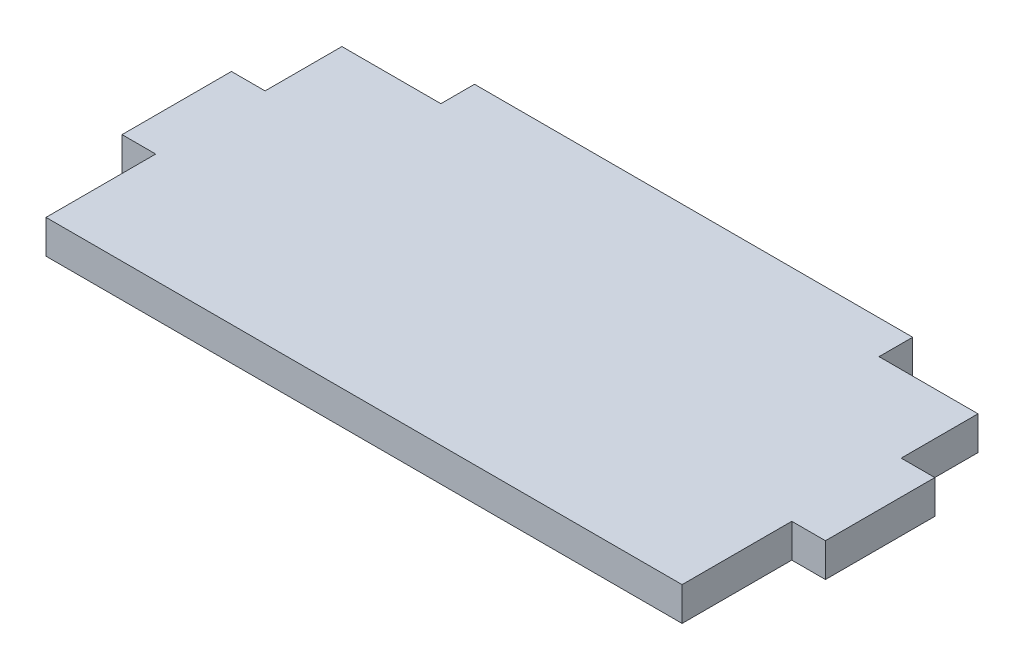
ISO-10303-21;
HEADER;
FILE_DESCRIPTION(('STEP AP214'),'2;1');
FILE_NAME('part.step','',(''),(''),'','','');
FILE_SCHEMA(('AUTOMOTIVE_DESIGN { 1 0 10303 214 1 1 1 1 }'));
ENDSEC;
DATA;
#1=APPLICATION_CONTEXT('core data for automotive mechanical design processes');
#2=APPLICATION_PROTOCOL_DEFINITION('international standard','automotive_design',2000,#1);
#3=PRODUCT_CONTEXT('',#1,'mechanical');
#4=PRODUCT('Part','Part','',(#3));
#5=PRODUCT_RELATED_PRODUCT_CATEGORY('part','',(#4));
#6=PRODUCT_DEFINITION_FORMATION('','',#4);
#7=PRODUCT_DEFINITION_CONTEXT('part definition',#1,'design');
#8=PRODUCT_DEFINITION('design','',#6,#7);
#9=PRODUCT_DEFINITION_SHAPE('','',#8);
#10=(LENGTH_UNIT() NAMED_UNIT(*) SI_UNIT(.MILLI.,.METRE.));
#11=(NAMED_UNIT(*) PLANE_ANGLE_UNIT() SI_UNIT($,.RADIAN.));
#12=(NAMED_UNIT(*) SI_UNIT($,.STERADIAN.) SOLID_ANGLE_UNIT());
#13=UNCERTAINTY_MEASURE_WITH_UNIT(LENGTH_MEASURE(1.E-05),#10,'distance_accuracy_value','');
#14=(GEOMETRIC_REPRESENTATION_CONTEXT(3) GLOBAL_UNCERTAINTY_ASSIGNED_CONTEXT((#13)) GLOBAL_UNIT_ASSIGNED_CONTEXT((#10,
#11,#12)) REPRESENTATION_CONTEXT('',''));
#15=CARTESIAN_POINT('',(0.,0.,0.));
#16=DIRECTION('',(0.,0.,1.));
#17=DIRECTION('',(1.,0.,0.));
#18=AXIS2_PLACEMENT_3D('',#15,#16,#17);
#19=CARTESIAN_POINT('',(-19.99,95.99,-4.07));
#20=DIRECTION('',(0.,0.,1.));
#21=DIRECTION('',(1.,0.,0.));
#22=AXIS2_PLACEMENT_3D('',#19,#20,#21);
#23=PLANE('',#22);
#24=DIRECTION('',(-1.,0.,0.));
#25=VECTOR('',#24,1.);
#26=CARTESIAN_POINT('',(-19.99,92.92,-4.07));
#27=LINE('',#26,#25);
#28=CARTESIAN_POINT('',(19.99,92.92,-4.07));
#29=VERTEX_POINT('',#28);
#30=CARTESIAN_POINT('',(-19.99,92.92,-4.07));
#31=VERTEX_POINT('',#30);
#32=EDGE_CURVE('E187',#29,#31,#27,.T.);
#33=ORIENTED_EDGE('',*,*,#32,.T.);
#34=DIRECTION('',(0.,-1.,0.));
#35=VECTOR('',#34,1.);
#36=CARTESIAN_POINT('',(-19.99,95.99,-4.07));
#37=LINE('',#36,#35);
#38=CARTESIAN_POINT('',(-19.99,95.99,-4.07));
#39=VERTEX_POINT('',#38);
#40=EDGE_CURVE('E11',#39,#31,#37,.T.);
#41=ORIENTED_EDGE('',*,*,#40,.F.);
#42=DIRECTION('',(-1.,0.,0.));
#43=VECTOR('',#42,1.);
#44=CARTESIAN_POINT('',(-19.99,95.99,-4.07));
#45=LINE('',#44,#43);
#46=CARTESIAN_POINT('',(19.99,95.99,-4.07));
#47=VERTEX_POINT('',#46);
#48=EDGE_CURVE('E217',#47,#39,#45,.T.);
#49=ORIENTED_EDGE('',*,*,#48,.F.);
#50=DIRECTION('',(0.,-1.,0.));
#51=VECTOR('',#50,1.);
#52=CARTESIAN_POINT('',(19.99,95.99,-4.07));
#53=LINE('',#52,#51);
#54=EDGE_CURVE('E183',#47,#29,#53,.T.);
#55=ORIENTED_EDGE('',*,*,#54,.T.);
#56=EDGE_LOOP('',(#33,#41,#49,#55));
#57=FACE_BOUND('',#56,.T.);
#58=ADVANCED_FACE('F43',(#57),#23,.F.);
#59=CARTESIAN_POINT('',(-19.99,95.99,-1.));
#60=DIRECTION('',(1.,0.,0.));
#61=DIRECTION('',(0.,0.,-1.));
#62=AXIS2_PLACEMENT_3D('',#59,#60,#61);
#63=PLANE('',#62);
#64=DIRECTION('',(0.,0.,1.));
#65=VECTOR('',#64,1.);
#66=CARTESIAN_POINT('',(-19.99,92.92,-1.));
#67=LINE('',#66,#65);
#68=CARTESIAN_POINT('',(-19.99,92.92,-1.));
#69=VERTEX_POINT('',#68);
#70=EDGE_CURVE('E190',#31,#69,#67,.T.);
#71=ORIENTED_EDGE('',*,*,#70,.T.);
#72=DIRECTION('',(0.,-1.,0.));
#73=VECTOR('',#72,1.);
#74=CARTESIAN_POINT('',(-19.99,95.99,-1.));
#75=LINE('',#74,#73);
#76=CARTESIAN_POINT('',(-19.99,95.99,-1.));
#77=VERTEX_POINT('',#76);
#78=EDGE_CURVE('E51',#77,#69,#75,.T.);
#79=ORIENTED_EDGE('',*,*,#78,.F.);
#80=DIRECTION('',(0.,0.,1.));
#81=VECTOR('',#80,1.);
#82=CARTESIAN_POINT('',(-19.99,95.99,-1.));
#83=LINE('',#82,#81);
#84=EDGE_CURVE('E126',#39,#77,#83,.T.);
#85=ORIENTED_EDGE('',*,*,#84,.F.);
#86=ORIENTED_EDGE('',*,*,#40,.T.);
#87=EDGE_LOOP('',(#71,#79,#85,#86));
#88=FACE_BOUND('',#87,.T.);
#89=ADVANCED_FACE('F316',(#88),#63,.F.);
#90=CARTESIAN_POINT('',(-29.02,95.99,-1.));
#91=DIRECTION('',(0.,0.,1.));
#92=DIRECTION('',(1.,0.,0.));
#93=AXIS2_PLACEMENT_3D('',#90,#91,#92);
#94=PLANE('',#93);
#95=DIRECTION('',(-1.,0.,0.));
#96=VECTOR('',#95,1.);
#97=CARTESIAN_POINT('',(-29.02,92.92,-1.));
#98=LINE('',#97,#96);
#99=CARTESIAN_POINT('',(-29.02,92.92,-1.));
#100=VERTEX_POINT('',#99);
#101=EDGE_CURVE('E192',#69,#100,#98,.T.);
#102=ORIENTED_EDGE('',*,*,#101,.T.);
#103=DIRECTION('',(0.,-1.,0.));
#104=VECTOR('',#103,1.);
#105=CARTESIAN_POINT('',(-29.02,95.99,-1.));
#106=LINE('',#105,#104);
#107=CARTESIAN_POINT('',(-29.02,95.99,-1.));
#108=VERTEX_POINT('',#107);
#109=EDGE_CURVE('E248',#108,#100,#106,.T.);
#110=ORIENTED_EDGE('',*,*,#109,.F.);
#111=DIRECTION('',(-1.,0.,0.));
#112=VECTOR('',#111,1.);
#113=CARTESIAN_POINT('',(-29.02,95.99,-1.));
#114=LINE('',#113,#112);
#115=EDGE_CURVE('E256',#77,#108,#114,.T.);
#116=ORIENTED_EDGE('',*,*,#115,.F.);
#117=ORIENTED_EDGE('',*,*,#78,.T.);
#118=EDGE_LOOP('',(#102,#110,#116,#117));
#119=FACE_BOUND('',#118,.T.);
#120=ADVANCED_FACE('F254',(#119),#94,.F.);
#121=CARTESIAN_POINT('',(-29.02,95.99,6.01));
#122=DIRECTION('',(1.,0.,0.));
#123=DIRECTION('',(0.,0.,-1.));
#124=AXIS2_PLACEMENT_3D('',#121,#122,#123);
#125=PLANE('',#124);
#126=DIRECTION('',(0.,0.,1.));
#127=VECTOR('',#126,1.);
#128=CARTESIAN_POINT('',(-29.02,92.92,6.01));
#129=LINE('',#128,#127);
#130=CARTESIAN_POINT('',(-29.02,92.92,6.01));
#131=VERTEX_POINT('',#130);
#132=EDGE_CURVE('E194',#100,#131,#129,.T.);
#133=ORIENTED_EDGE('',*,*,#132,.T.);
#134=DIRECTION('',(0.,-1.,0.));
#135=VECTOR('',#134,1.);
#136=CARTESIAN_POINT('',(-29.02,95.99,6.01));
#137=LINE('',#136,#135);
#138=CARTESIAN_POINT('',(-29.02,95.99,6.01));
#139=VERTEX_POINT('',#138);
#140=EDGE_CURVE('E245',#139,#131,#137,.T.);
#141=ORIENTED_EDGE('',*,*,#140,.F.);
#142=DIRECTION('',(0.,0.,1.));
#143=VECTOR('',#142,1.);
#144=CARTESIAN_POINT('',(-29.02,95.99,6.01));
#145=LINE('',#144,#143);
#146=EDGE_CURVE('E274',#108,#139,#145,.T.);
#147=ORIENTED_EDGE('',*,*,#146,.F.);
#148=ORIENTED_EDGE('',*,*,#109,.T.);
#149=EDGE_LOOP('',(#133,#141,#147,#148));
#150=FACE_BOUND('',#149,.T.);
#151=ADVANCED_FACE('F265',(#150),#125,.F.);
#152=CARTESIAN_POINT('',(-32.09,95.99,6.01));
#153=DIRECTION('',(0.,0.,1.));
#154=DIRECTION('',(1.,0.,0.));
#155=AXIS2_PLACEMENT_3D('',#152,#153,#154);
#156=PLANE('',#155);
#157=DIRECTION('',(-1.,0.,0.));
#158=VECTOR('',#157,1.);
#159=CARTESIAN_POINT('',(-32.09,92.92,6.01));
#160=LINE('',#159,#158);
#161=CARTESIAN_POINT('',(-32.09,92.92,6.01));
#162=VERTEX_POINT('',#161);
#163=EDGE_CURVE('E196',#131,#162,#160,.T.);
#164=ORIENTED_EDGE('',*,*,#163,.T.);
#165=DIRECTION('',(0.,-1.,0.));
#166=VECTOR('',#165,1.);
#167=CARTESIAN_POINT('',(-32.09,95.99,6.01));
#168=LINE('',#167,#166);
#169=CARTESIAN_POINT('',(-32.09,95.99,6.01));
#170=VERTEX_POINT('',#169);
#171=EDGE_CURVE('E242',#170,#162,#168,.T.);
#172=ORIENTED_EDGE('',*,*,#171,.F.);
#173=DIRECTION('',(-1.,0.,0.));
#174=VECTOR('',#173,1.);
#175=CARTESIAN_POINT('',(-32.09,95.99,6.01));
#176=LINE('',#175,#174);
#177=EDGE_CURVE('E271',#139,#170,#176,.T.);
#178=ORIENTED_EDGE('',*,*,#177,.F.);
#179=ORIENTED_EDGE('',*,*,#140,.T.);
#180=EDGE_LOOP('',(#164,#172,#178,#179));
#181=FACE_BOUND('',#180,.T.);
#182=ADVANCED_FACE('F269',(#181),#156,.F.);
#183=CARTESIAN_POINT('',(-32.09,95.99,15.99));
#184=DIRECTION('',(1.,0.,0.));
#185=DIRECTION('',(0.,0.,-1.));
#186=AXIS2_PLACEMENT_3D('',#183,#184,#185);
#187=PLANE('',#186);
#188=DIRECTION('',(0.,0.,1.));
#189=VECTOR('',#188,1.);
#190=CARTESIAN_POINT('',(-32.09,92.92,15.99));
#191=LINE('',#190,#189);
#192=CARTESIAN_POINT('',(-32.09,92.92,15.99));
#193=VERTEX_POINT('',#192);
#194=EDGE_CURVE('E198',#162,#193,#191,.T.);
#195=ORIENTED_EDGE('',*,*,#194,.T.);
#196=DIRECTION('',(0.,-1.,0.));
#197=VECTOR('',#196,1.);
#198=CARTESIAN_POINT('',(-32.09,95.99,15.99));
#199=LINE('',#198,#197);
#200=CARTESIAN_POINT('',(-32.09,95.99,15.99));
#201=VERTEX_POINT('',#200);
#202=EDGE_CURVE('E239',#201,#193,#199,.T.);
#203=ORIENTED_EDGE('',*,*,#202,.F.);
#204=DIRECTION('',(0.,0.,1.));
#205=VECTOR('',#204,1.);
#206=CARTESIAN_POINT('',(-32.09,95.99,15.99));
#207=LINE('',#206,#205);
#208=EDGE_CURVE('E273',#170,#201,#207,.T.);
#209=ORIENTED_EDGE('',*,*,#208,.F.);
#210=ORIENTED_EDGE('',*,*,#171,.T.);
#211=EDGE_LOOP('',(#195,#203,#209,#210));
#212=FACE_BOUND('',#211,.T.);
#213=ADVANCED_FACE('F331',(#212),#187,.F.);
#214=CARTESIAN_POINT('',(-29.02,95.99,15.99));
#215=DIRECTION('',(0.,0.,-1.));
#216=DIRECTION('',(-1.,0.,0.));
#217=AXIS2_PLACEMENT_3D('',#214,#215,#216);
#218=PLANE('',#217);
#219=DIRECTION('',(1.,0.,0.));
#220=VECTOR('',#219,1.);
#221=CARTESIAN_POINT('',(-29.02,92.92,15.99));
#222=LINE('',#221,#220);
#223=CARTESIAN_POINT('',(-29.02,92.92,15.99));
#224=VERTEX_POINT('',#223);
#225=EDGE_CURVE('E200',#193,#224,#222,.T.);
#226=ORIENTED_EDGE('',*,*,#225,.T.);
#227=DIRECTION('',(0.,-1.,0.));
#228=VECTOR('',#227,1.);
#229=CARTESIAN_POINT('',(-29.02,95.99,15.99));
#230=LINE('',#229,#228);
#231=CARTESIAN_POINT('',(-29.02,95.99,15.99));
#232=VERTEX_POINT('',#231);
#233=EDGE_CURVE('E236',#232,#224,#230,.T.);
#234=ORIENTED_EDGE('',*,*,#233,.F.);
#235=DIRECTION('',(1.,0.,0.));
#236=VECTOR('',#235,1.);
#237=CARTESIAN_POINT('',(-29.02,95.99,15.99));
#238=LINE('',#237,#236);
#239=EDGE_CURVE('E276',#201,#232,#238,.T.);
#240=ORIENTED_EDGE('',*,*,#239,.F.);
#241=ORIENTED_EDGE('',*,*,#202,.T.);
#242=EDGE_LOOP('',(#226,#234,#240,#241));
#243=FACE_BOUND('',#242,.T.);
#244=ADVANCED_FACE('F334',(#243),#218,.F.);
#245=CARTESIAN_POINT('',(-29.02,95.99,26.));
#246=DIRECTION('',(1.,0.,0.));
#247=DIRECTION('',(0.,0.,-1.));
#248=AXIS2_PLACEMENT_3D('',#245,#246,#247);
#249=PLANE('',#248);
#250=DIRECTION('',(0.,0.,1.));
#251=VECTOR('',#250,1.);
#252=CARTESIAN_POINT('',(-29.02,92.92,26.));
#253=LINE('',#252,#251);
#254=CARTESIAN_POINT('',(-29.02,92.92,26.));
#255=VERTEX_POINT('',#254);
#256=EDGE_CURVE('E202',#224,#255,#253,.T.);
#257=ORIENTED_EDGE('',*,*,#256,.T.);
#258=DIRECTION('',(0.,-1.,0.));
#259=VECTOR('',#258,1.);
#260=CARTESIAN_POINT('',(-29.02,95.99,26.));
#261=LINE('',#260,#259);
#262=CARTESIAN_POINT('',(-29.02,95.99,26.));
#263=VERTEX_POINT('',#262);
#264=EDGE_CURVE('E233',#263,#255,#261,.T.);
#265=ORIENTED_EDGE('',*,*,#264,.F.);
#266=DIRECTION('',(0.,0.,1.));
#267=VECTOR('',#266,1.);
#268=CARTESIAN_POINT('',(-29.02,95.99,26.));
#269=LINE('',#268,#267);
#270=EDGE_CURVE('E282',#232,#263,#269,.T.);
#271=ORIENTED_EDGE('',*,*,#270,.F.);
#272=ORIENTED_EDGE('',*,*,#233,.T.);
#273=EDGE_LOOP('',(#257,#265,#271,#272));
#274=FACE_BOUND('',#273,.T.);
#275=ADVANCED_FACE('F338',(#274),#249,.F.);
#276=CARTESIAN_POINT('',(29.02,95.99,26.));
#277=DIRECTION('',(0.,0.,-1.));
#278=DIRECTION('',(-1.,0.,0.));
#279=AXIS2_PLACEMENT_3D('',#276,#277,#278);
#280=PLANE('',#279);
#281=DIRECTION('',(1.,0.,0.));
#282=VECTOR('',#281,1.);
#283=CARTESIAN_POINT('',(29.02,92.92,26.));
#284=LINE('',#283,#282);
#285=CARTESIAN_POINT('',(29.02,92.92,26.));
#286=VERTEX_POINT('',#285);
#287=EDGE_CURVE('E204',#255,#286,#284,.T.);
#288=ORIENTED_EDGE('',*,*,#287,.T.);
#289=DIRECTION('',(0.,-1.,0.));
#290=VECTOR('',#289,1.);
#291=CARTESIAN_POINT('',(29.02,95.99,26.));
#292=LINE('',#291,#290);
#293=CARTESIAN_POINT('',(29.02,95.99,26.));
#294=VERTEX_POINT('',#293);
#295=EDGE_CURVE('E230',#294,#286,#292,.T.);
#296=ORIENTED_EDGE('',*,*,#295,.F.);
#297=DIRECTION('',(1.,0.,0.));
#298=VECTOR('',#297,1.);
#299=CARTESIAN_POINT('',(29.02,95.99,26.));
#300=LINE('',#299,#298);
#301=EDGE_CURVE('E284',#263,#294,#300,.T.);
#302=ORIENTED_EDGE('',*,*,#301,.F.);
#303=ORIENTED_EDGE('',*,*,#264,.T.);
#304=EDGE_LOOP('',(#288,#296,#302,#303));
#305=FACE_BOUND('',#304,.T.);
#306=ADVANCED_FACE('F342',(#305),#280,.F.);
#307=CARTESIAN_POINT('',(29.02,95.99,15.99));
#308=DIRECTION('',(-1.,0.,0.));
#309=DIRECTION('',(0.,0.,1.));
#310=AXIS2_PLACEMENT_3D('',#307,#308,#309);
#311=PLANE('',#310);
#312=DIRECTION('',(0.,0.,-1.));
#313=VECTOR('',#312,1.);
#314=CARTESIAN_POINT('',(29.02,92.92,15.99));
#315=LINE('',#314,#313);
#316=CARTESIAN_POINT('',(29.02,92.92,15.99));
#317=VERTEX_POINT('',#316);
#318=EDGE_CURVE('E206',#286,#317,#315,.T.);
#319=ORIENTED_EDGE('',*,*,#318,.T.);
#320=DIRECTION('',(0.,-1.,0.));
#321=VECTOR('',#320,1.);
#322=CARTESIAN_POINT('',(29.02,95.99,15.99));
#323=LINE('',#322,#321);
#324=CARTESIAN_POINT('',(29.02,95.99,15.99));
#325=VERTEX_POINT('',#324);
#326=EDGE_CURVE('E227',#325,#317,#323,.T.);
#327=ORIENTED_EDGE('',*,*,#326,.F.);
#328=DIRECTION('',(0.,0.,-1.));
#329=VECTOR('',#328,1.);
#330=CARTESIAN_POINT('',(29.02,95.99,15.99));
#331=LINE('',#330,#329);
#332=EDGE_CURVE('E286',#294,#325,#331,.T.);
#333=ORIENTED_EDGE('',*,*,#332,.F.);
#334=ORIENTED_EDGE('',*,*,#295,.T.);
#335=EDGE_LOOP('',(#319,#327,#333,#334));
#336=FACE_BOUND('',#335,.T.);
#337=ADVANCED_FACE('F346',(#336),#311,.F.);
#338=CARTESIAN_POINT('',(32.09,95.99,15.99));
#339=DIRECTION('',(0.,0.,-1.));
#340=DIRECTION('',(-1.,0.,0.));
#341=AXIS2_PLACEMENT_3D('',#338,#339,#340);
#342=PLANE('',#341);
#343=DIRECTION('',(1.,0.,0.));
#344=VECTOR('',#343,1.);
#345=CARTESIAN_POINT('',(32.09,92.92,15.99));
#346=LINE('',#345,#344);
#347=CARTESIAN_POINT('',(32.09,92.92,15.99));
#348=VERTEX_POINT('',#347);
#349=EDGE_CURVE('E208',#317,#348,#346,.T.);
#350=ORIENTED_EDGE('',*,*,#349,.T.);
#351=DIRECTION('',(0.,-1.,0.));
#352=VECTOR('',#351,1.);
#353=CARTESIAN_POINT('',(32.09,95.99,15.99));
#354=LINE('',#353,#352);
#355=CARTESIAN_POINT('',(32.09,95.99,15.99));
#356=VERTEX_POINT('',#355);
#357=EDGE_CURVE('E224',#356,#348,#354,.T.);
#358=ORIENTED_EDGE('',*,*,#357,.F.);
#359=DIRECTION('',(1.,0.,0.));
#360=VECTOR('',#359,1.);
#361=CARTESIAN_POINT('',(32.09,95.99,15.99));
#362=LINE('',#361,#360);
#363=EDGE_CURVE('E288',#325,#356,#362,.T.);
#364=ORIENTED_EDGE('',*,*,#363,.F.);
#365=ORIENTED_EDGE('',*,*,#326,.T.);
#366=EDGE_LOOP('',(#350,#358,#364,#365));
#367=FACE_BOUND('',#366,.T.);
#368=ADVANCED_FACE('F350',(#367),#342,.F.);
#369=CARTESIAN_POINT('',(32.09,95.99,6.01));
#370=DIRECTION('',(-1.,0.,0.));
#371=DIRECTION('',(0.,0.,1.));
#372=AXIS2_PLACEMENT_3D('',#369,#370,#371);
#373=PLANE('',#372);
#374=DIRECTION('',(0.,0.,-1.));
#375=VECTOR('',#374,1.);
#376=CARTESIAN_POINT('',(32.09,92.92,6.01));
#377=LINE('',#376,#375);
#378=CARTESIAN_POINT('',(32.09,92.92,6.01));
#379=VERTEX_POINT('',#378);
#380=EDGE_CURVE('E210',#348,#379,#377,.T.);
#381=ORIENTED_EDGE('',*,*,#380,.T.);
#382=DIRECTION('',(0.,-1.,0.));
#383=VECTOR('',#382,1.);
#384=CARTESIAN_POINT('',(32.09,95.99,6.01));
#385=LINE('',#384,#383);
#386=CARTESIAN_POINT('',(32.09,95.99,6.01));
#387=VERTEX_POINT('',#386);
#388=EDGE_CURVE('E221',#387,#379,#385,.T.);
#389=ORIENTED_EDGE('',*,*,#388,.F.);
#390=DIRECTION('',(0.,0.,-1.));
#391=VECTOR('',#390,1.);
#392=CARTESIAN_POINT('',(32.09,95.99,6.01));
#393=LINE('',#392,#391);
#394=EDGE_CURVE('E290',#356,#387,#393,.T.);
#395=ORIENTED_EDGE('',*,*,#394,.F.);
#396=ORIENTED_EDGE('',*,*,#357,.T.);
#397=EDGE_LOOP('',(#381,#389,#395,#396));
#398=FACE_BOUND('',#397,.T.);
#399=ADVANCED_FACE('F296',(#398),#373,.F.);
#400=CARTESIAN_POINT('',(29.02,95.99,6.01));
#401=DIRECTION('',(0.,0.,1.));
#402=DIRECTION('',(1.,0.,0.));
#403=AXIS2_PLACEMENT_3D('',#400,#401,#402);
#404=PLANE('',#403);
#405=DIRECTION('',(-1.,0.,0.));
#406=VECTOR('',#405,1.);
#407=CARTESIAN_POINT('',(29.02,92.92,6.01));
#408=LINE('',#407,#406);
#409=CARTESIAN_POINT('',(29.02,92.92,6.01));
#410=VERTEX_POINT('',#409);
#411=EDGE_CURVE('E212',#379,#410,#408,.T.);
#412=ORIENTED_EDGE('',*,*,#411,.T.);
#413=DIRECTION('',(0.,-1.,0.));
#414=VECTOR('',#413,1.);
#415=CARTESIAN_POINT('',(29.02,95.99,6.01));
#416=LINE('',#415,#414);
#417=CARTESIAN_POINT('',(29.02,95.99,6.01));
#418=VERTEX_POINT('',#417);
#419=EDGE_CURVE('E178',#418,#410,#416,.T.);
#420=ORIENTED_EDGE('',*,*,#419,.F.);
#421=DIRECTION('',(-1.,0.,0.));
#422=VECTOR('',#421,1.);
#423=CARTESIAN_POINT('',(29.02,95.99,6.01));
#424=LINE('',#423,#422);
#425=EDGE_CURVE('E169',#387,#418,#424,.T.);
#426=ORIENTED_EDGE('',*,*,#425,.F.);
#427=ORIENTED_EDGE('',*,*,#388,.T.);
#428=EDGE_LOOP('',(#412,#420,#426,#427));
#429=FACE_BOUND('',#428,.T.);
#430=ADVANCED_FACE('F300',(#429),#404,.F.);
#431=CARTESIAN_POINT('',(29.02,95.99,-1.));
#432=DIRECTION('',(-1.,0.,0.));
#433=DIRECTION('',(0.,0.,1.));
#434=AXIS2_PLACEMENT_3D('',#431,#432,#433);
#435=PLANE('',#434);
#436=DIRECTION('',(0.,0.,-1.));
#437=VECTOR('',#436,1.);
#438=CARTESIAN_POINT('',(29.02,92.92,-1.));
#439=LINE('',#438,#437);
#440=CARTESIAN_POINT('',(29.02,92.92,-1.));
#441=VERTEX_POINT('',#440);
#442=EDGE_CURVE('E177',#410,#441,#439,.T.);
#443=ORIENTED_EDGE('',*,*,#442,.T.);
#444=DIRECTION('',(0.,-1.,0.));
#445=VECTOR('',#444,1.);
#446=CARTESIAN_POINT('',(29.02,95.99,-1.));
#447=LINE('',#446,#445);
#448=CARTESIAN_POINT('',(29.02,95.99,-1.));
#449=VERTEX_POINT('',#448);
#450=EDGE_CURVE('E174',#449,#441,#447,.T.);
#451=ORIENTED_EDGE('',*,*,#450,.F.);
#452=DIRECTION('',(0.,0.,-1.));
#453=VECTOR('',#452,1.);
#454=CARTESIAN_POINT('',(29.02,95.99,-1.));
#455=LINE('',#454,#453);
#456=EDGE_CURVE('E163',#418,#449,#455,.T.);
#457=ORIENTED_EDGE('',*,*,#456,.F.);
#458=ORIENTED_EDGE('',*,*,#419,.T.);
#459=EDGE_LOOP('',(#443,#451,#457,#458));
#460=FACE_BOUND('',#459,.T.);
#461=ADVANCED_FACE('F175',(#460),#435,.F.);
#462=CARTESIAN_POINT('',(19.99,95.99,-1.));
#463=DIRECTION('',(0.,0.,1.));
#464=DIRECTION('',(1.,0.,0.));
#465=AXIS2_PLACEMENT_3D('',#462,#463,#464);
#466=PLANE('',#465);
#467=DIRECTION('',(-1.,0.,0.));
#468=VECTOR('',#467,1.);
#469=CARTESIAN_POINT('',(19.99,92.92,-1.));
#470=LINE('',#469,#468);
#471=CARTESIAN_POINT('',(19.99,92.92,-1.));
#472=VERTEX_POINT('',#471);
#473=EDGE_CURVE('E112',#441,#472,#470,.T.);
#474=ORIENTED_EDGE('',*,*,#473,.T.);
#475=DIRECTION('',(0.,-1.,0.));
#476=VECTOR('',#475,1.);
#477=CARTESIAN_POINT('',(19.99,95.99,-1.));
#478=LINE('',#477,#476);
#479=CARTESIAN_POINT('',(19.99,95.99,-1.));
#480=VERTEX_POINT('',#479);
#481=EDGE_CURVE('E179',#480,#472,#478,.T.);
#482=ORIENTED_EDGE('',*,*,#481,.F.);
#483=DIRECTION('',(-1.,0.,0.));
#484=VECTOR('',#483,1.);
#485=CARTESIAN_POINT('',(19.99,95.99,-1.));
#486=LINE('',#485,#484);
#487=EDGE_CURVE('E167',#449,#480,#486,.T.);
#488=ORIENTED_EDGE('',*,*,#487,.F.);
#489=ORIENTED_EDGE('',*,*,#450,.T.);
#490=EDGE_LOOP('',(#474,#482,#488,#489));
#491=FACE_BOUND('',#490,.T.);
#492=ADVANCED_FACE('F181',(#491),#466,.F.);
#493=CARTESIAN_POINT('',(19.99,95.99,-4.07));
#494=DIRECTION('',(-1.,0.,0.));
#495=DIRECTION('',(0.,0.,1.));
#496=AXIS2_PLACEMENT_3D('',#493,#494,#495);
#497=PLANE('',#496);
#498=DIRECTION('',(0.,0.,-1.));
#499=VECTOR('',#498,1.);
#500=CARTESIAN_POINT('',(19.99,92.92,-4.07));
#501=LINE('',#500,#499);
#502=EDGE_CURVE('E118',#472,#29,#501,.T.);
#503=ORIENTED_EDGE('',*,*,#502,.T.);
#504=ORIENTED_EDGE('',*,*,#54,.F.);
#505=DIRECTION('',(0.,0.,-1.));
#506=VECTOR('',#505,1.);
#507=CARTESIAN_POINT('',(19.99,95.99,-4.07));
#508=LINE('',#507,#506);
#509=EDGE_CURVE('E59',#480,#47,#508,.T.);
#510=ORIENTED_EDGE('',*,*,#509,.F.);
#511=ORIENTED_EDGE('',*,*,#481,.T.);
#512=EDGE_LOOP('',(#503,#504,#510,#511));
#513=FACE_BOUND('',#512,.T.);
#514=ADVANCED_FACE('F304',(#513),#497,.F.);
#515=CARTESIAN_POINT('',(0.,95.99,0.));
#516=DIRECTION('',(0.,-1.,0.));
#517=DIRECTION('',(0.,0.,-1.));
#518=AXIS2_PLACEMENT_3D('',#515,#516,#517);
#519=PLANE('',#518);
#520=ORIENTED_EDGE('',*,*,#48,.T.);
#521=ORIENTED_EDGE('',*,*,#84,.T.);
#522=ORIENTED_EDGE('',*,*,#115,.T.);
#523=ORIENTED_EDGE('',*,*,#146,.T.);
#524=ORIENTED_EDGE('',*,*,#177,.T.);
#525=ORIENTED_EDGE('',*,*,#208,.T.);
#526=ORIENTED_EDGE('',*,*,#239,.T.);
#527=ORIENTED_EDGE('',*,*,#270,.T.);
#528=ORIENTED_EDGE('',*,*,#301,.T.);
#529=ORIENTED_EDGE('',*,*,#332,.T.);
#530=ORIENTED_EDGE('',*,*,#363,.T.);
#531=ORIENTED_EDGE('',*,*,#394,.T.);
#532=ORIENTED_EDGE('',*,*,#425,.T.);
#533=ORIENTED_EDGE('',*,*,#456,.T.);
#534=ORIENTED_EDGE('',*,*,#487,.T.);
#535=ORIENTED_EDGE('',*,*,#509,.T.);
#536=EDGE_LOOP('',(#520,#521,#522,#523,#524,#525,#526,#527,#528,#529,#530,#531,#532,#533,#534,#535));
#537=FACE_BOUND('',#536,.T.);
#538=ADVANCED_FACE('F165',(#537),#519,.F.);
#539=CARTESIAN_POINT('',(0.,92.92,0.));
#540=DIRECTION('',(0.,-1.,0.));
#541=DIRECTION('',(0.,0.,-1.));
#542=AXIS2_PLACEMENT_3D('',#539,#540,#541);
#543=PLANE('',#542);
#544=ORIENTED_EDGE('',*,*,#32,.F.);
#545=ORIENTED_EDGE('',*,*,#502,.F.);
#546=ORIENTED_EDGE('',*,*,#473,.F.);
#547=ORIENTED_EDGE('',*,*,#442,.F.);
#548=ORIENTED_EDGE('',*,*,#411,.F.);
#549=ORIENTED_EDGE('',*,*,#380,.F.);
#550=ORIENTED_EDGE('',*,*,#349,.F.);
#551=ORIENTED_EDGE('',*,*,#318,.F.);
#552=ORIENTED_EDGE('',*,*,#287,.F.);
#553=ORIENTED_EDGE('',*,*,#256,.F.);
#554=ORIENTED_EDGE('',*,*,#225,.F.);
#555=ORIENTED_EDGE('',*,*,#194,.F.);
#556=ORIENTED_EDGE('',*,*,#163,.F.);
#557=ORIENTED_EDGE('',*,*,#132,.F.);
#558=ORIENTED_EDGE('',*,*,#101,.F.);
#559=ORIENTED_EDGE('',*,*,#70,.F.);
#560=EDGE_LOOP('',(#544,#545,#546,#547,#548,#549,#550,#551,#552,#553,#554,#555,#556,#557,#558,#559));
#561=FACE_BOUND('',#560,.T.);
#562=ADVANCED_FACE('F260',(#561),#543,.T.);
#563=CLOSED_SHELL('',(#58,#89,#120,#151,#182,#213,#244,#275,#306,#337,#368,#399,#430,#461,#492,
#514,#538,#562));
#564=MANIFOLD_SOLID_BREP('B2',#563);
#565=ADVANCED_BREP_SHAPE_REPRESENTATION('',(#18,#564),#14);
#566=SHAPE_DEFINITION_REPRESENTATION(#9,#565);
ENDSEC;
END-ISO-10303-21;
